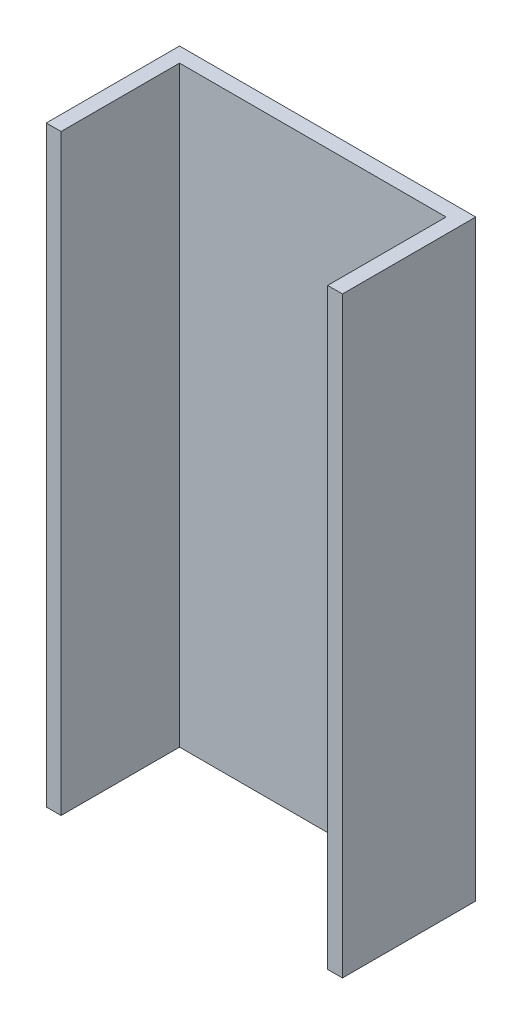
ISO-10303-21;
HEADER;
FILE_DESCRIPTION(('STEP AP214'),'2;1');
FILE_NAME('part.step','',(''),(''),'','','');
FILE_SCHEMA(('AUTOMOTIVE_DESIGN { 1 0 10303 214 1 1 1 1 }'));
ENDSEC;
DATA;
#1=APPLICATION_CONTEXT('core data for automotive mechanical design processes');
#2=APPLICATION_PROTOCOL_DEFINITION('international standard','automotive_design',2000,#1);
#3=PRODUCT_CONTEXT('',#1,'mechanical');
#4=PRODUCT('Part','Part','',(#3));
#5=PRODUCT_RELATED_PRODUCT_CATEGORY('part','',(#4));
#6=PRODUCT_DEFINITION_FORMATION('','',#4);
#7=PRODUCT_DEFINITION_CONTEXT('part definition',#1,'design');
#8=PRODUCT_DEFINITION('design','',#6,#7);
#9=PRODUCT_DEFINITION_SHAPE('','',#8);
#10=(LENGTH_UNIT() NAMED_UNIT(*) SI_UNIT(.MILLI.,.METRE.));
#11=(NAMED_UNIT(*) PLANE_ANGLE_UNIT() SI_UNIT($,.RADIAN.));
#12=(NAMED_UNIT(*) SI_UNIT($,.STERADIAN.) SOLID_ANGLE_UNIT());
#13=UNCERTAINTY_MEASURE_WITH_UNIT(LENGTH_MEASURE(1.E-05),#10,'distance_accuracy_value','');
#14=(GEOMETRIC_REPRESENTATION_CONTEXT(3) GLOBAL_UNCERTAINTY_ASSIGNED_CONTEXT((#13)) GLOBAL_UNIT_ASSIGNED_CONTEXT((#10,
#11,#12)) REPRESENTATION_CONTEXT('',''));
#15=CARTESIAN_POINT('',(0.,0.,0.));
#16=DIRECTION('',(0.,0.,1.));
#17=DIRECTION('',(1.,0.,0.));
#18=AXIS2_PLACEMENT_3D('',#15,#16,#17);
#19=CARTESIAN_POINT('',(-1000.,4000.,400.));
#20=DIRECTION('',(0.,0.,-1.));
#21=DIRECTION('',(-1.,0.,0.));
#22=AXIS2_PLACEMENT_3D('',#19,#20,#21);
#23=PLANE('',#22);
#24=DIRECTION('',(1.,0.,0.));
#25=VECTOR('',#24,1.);
#26=CARTESIAN_POINT('',(-1000.,0.,400.));
#27=LINE('',#26,#25);
#28=CARTESIAN_POINT('',(-1000.,0.,400.));
#29=VERTEX_POINT('',#28);
#30=CARTESIAN_POINT('',(-900.,0.,400.));
#31=VERTEX_POINT('',#30);
#32=EDGE_CURVE('E146',#29,#31,#27,.T.);
#33=ORIENTED_EDGE('',*,*,#32,.T.);
#34=DIRECTION('',(0.,-1.,0.));
#35=VECTOR('',#34,1.);
#36=CARTESIAN_POINT('',(-900.,4000.,400.));
#37=LINE('',#36,#35);
#38=CARTESIAN_POINT('',(-900.,4000.,400.));
#39=VERTEX_POINT('',#38);
#40=EDGE_CURVE('E11',#39,#31,#37,.T.);
#41=ORIENTED_EDGE('',*,*,#40,.F.);
#42=DIRECTION('',(1.,0.,0.));
#43=VECTOR('',#42,1.);
#44=CARTESIAN_POINT('',(-1000.,4000.,400.));
#45=LINE('',#44,#43);
#46=CARTESIAN_POINT('',(-1000.,4000.,400.));
#47=VERTEX_POINT('',#46);
#48=EDGE_CURVE('E168',#47,#39,#45,.T.);
#49=ORIENTED_EDGE('',*,*,#48,.F.);
#50=DIRECTION('',(0.,-1.,0.));
#51=VECTOR('',#50,1.);
#52=CARTESIAN_POINT('',(-1000.,4000.,400.));
#53=LINE('',#52,#51);
#54=EDGE_CURVE('E142',#47,#29,#53,.T.);
#55=ORIENTED_EDGE('',*,*,#54,.T.);
#56=EDGE_LOOP('',(#33,#41,#49,#55));
#57=FACE_BOUND('',#56,.T.);
#58=ADVANCED_FACE('F45',(#57),#23,.F.);
#59=CARTESIAN_POINT('',(-900.,4000.,-400.));
#60=DIRECTION('',(-1.,0.,0.));
#61=DIRECTION('',(0.,0.,1.));
#62=AXIS2_PLACEMENT_3D('',#59,#60,#61);
#63=PLANE('',#62);
#64=DIRECTION('',(0.,0.,-1.));
#65=VECTOR('',#64,1.);
#66=CARTESIAN_POINT('',(-900.,0.,-400.));
#67=LINE('',#66,#65);
#68=CARTESIAN_POINT('',(-900.,0.,-400.));
#69=VERTEX_POINT('',#68);
#70=EDGE_CURVE('E150',#31,#69,#67,.T.);
#71=ORIENTED_EDGE('',*,*,#70,.T.);
#72=DIRECTION('',(0.,-1.,0.));
#73=VECTOR('',#72,1.);
#74=CARTESIAN_POINT('',(-900.,4000.,-400.));
#75=LINE('',#74,#73);
#76=CARTESIAN_POINT('',(-900.,4000.,-400.));
#77=VERTEX_POINT('',#76);
#78=EDGE_CURVE('E54',#77,#69,#75,.T.);
#79=ORIENTED_EDGE('',*,*,#78,.F.);
#80=DIRECTION('',(0.,0.,-1.));
#81=VECTOR('',#80,1.);
#82=CARTESIAN_POINT('',(-900.,4000.,-400.));
#83=LINE('',#82,#81);
#84=EDGE_CURVE('E105',#39,#77,#83,.T.);
#85=ORIENTED_EDGE('',*,*,#84,.F.);
#86=ORIENTED_EDGE('',*,*,#40,.T.);
#87=EDGE_LOOP('',(#71,#79,#85,#86));
#88=FACE_BOUND('',#87,.T.);
#89=ADVANCED_FACE('F214',(#88),#63,.F.);
#90=CARTESIAN_POINT('',(900.,4000.,-400.));
#91=DIRECTION('',(0.,0.,-1.));
#92=DIRECTION('',(-1.,0.,0.));
#93=AXIS2_PLACEMENT_3D('',#90,#91,#92);
#94=PLANE('',#93);
#95=DIRECTION('',(1.,0.,0.));
#96=VECTOR('',#95,1.);
#97=CARTESIAN_POINT('',(900.,0.,-400.));
#98=LINE('',#97,#96);
#99=CARTESIAN_POINT('',(900.,0.,-400.));
#100=VERTEX_POINT('',#99);
#101=EDGE_CURVE('E153',#69,#100,#98,.T.);
#102=ORIENTED_EDGE('',*,*,#101,.T.);
#103=DIRECTION('',(0.,-1.,0.));
#104=VECTOR('',#103,1.);
#105=CARTESIAN_POINT('',(900.,4000.,-400.));
#106=LINE('',#105,#104);
#107=CARTESIAN_POINT('',(900.,4000.,-400.));
#108=VERTEX_POINT('',#107);
#109=EDGE_CURVE('E179',#108,#100,#106,.T.);
#110=ORIENTED_EDGE('',*,*,#109,.F.);
#111=DIRECTION('',(1.,0.,0.));
#112=VECTOR('',#111,1.);
#113=CARTESIAN_POINT('',(900.,4000.,-400.));
#114=LINE('',#113,#112);
#115=EDGE_CURVE('E189',#77,#108,#114,.T.);
#116=ORIENTED_EDGE('',*,*,#115,.F.);
#117=ORIENTED_EDGE('',*,*,#78,.T.);
#118=EDGE_LOOP('',(#102,#110,#116,#117));
#119=FACE_BOUND('',#118,.T.);
#120=ADVANCED_FACE('F187',(#119),#94,.F.);
#121=CARTESIAN_POINT('',(900.,4000.,400.));
#122=DIRECTION('',(1.,0.,0.));
#123=DIRECTION('',(0.,0.,-1.));
#124=AXIS2_PLACEMENT_3D('',#121,#122,#123);
#125=PLANE('',#124);
#126=DIRECTION('',(0.,0.,1.));
#127=VECTOR('',#126,1.);
#128=CARTESIAN_POINT('',(900.,0.,400.));
#129=LINE('',#128,#127);
#130=CARTESIAN_POINT('',(900.,0.,400.));
#131=VERTEX_POINT('',#130);
#132=EDGE_CURVE('E156',#100,#131,#129,.T.);
#133=ORIENTED_EDGE('',*,*,#132,.T.);
#134=DIRECTION('',(0.,-1.,0.));
#135=VECTOR('',#134,1.);
#136=CARTESIAN_POINT('',(900.,4000.,400.));
#137=LINE('',#136,#135);
#138=CARTESIAN_POINT('',(900.,4000.,400.));
#139=VERTEX_POINT('',#138);
#140=EDGE_CURVE('E175',#139,#131,#137,.T.);
#141=ORIENTED_EDGE('',*,*,#140,.F.);
#142=DIRECTION('',(0.,0.,1.));
#143=VECTOR('',#142,1.);
#144=CARTESIAN_POINT('',(900.,4000.,400.));
#145=LINE('',#144,#143);
#146=EDGE_CURVE('E202',#108,#139,#145,.T.);
#147=ORIENTED_EDGE('',*,*,#146,.F.);
#148=ORIENTED_EDGE('',*,*,#109,.T.);
#149=EDGE_LOOP('',(#133,#141,#147,#148));
#150=FACE_BOUND('',#149,.T.);
#151=ADVANCED_FACE('F197',(#150),#125,.F.);
#152=CARTESIAN_POINT('',(1000.,4000.,400.));
#153=DIRECTION('',(0.,0.,-1.));
#154=DIRECTION('',(-1.,0.,0.));
#155=AXIS2_PLACEMENT_3D('',#152,#153,#154);
#156=PLANE('',#155);
#157=DIRECTION('',(1.,0.,0.));
#158=VECTOR('',#157,1.);
#159=CARTESIAN_POINT('',(1000.,0.,400.));
#160=LINE('',#159,#158);
#161=CARTESIAN_POINT('',(1000.,0.,400.));
#162=VERTEX_POINT('',#161);
#163=EDGE_CURVE('E159',#131,#162,#160,.T.);
#164=ORIENTED_EDGE('',*,*,#163,.T.);
#165=DIRECTION('',(0.,-1.,0.));
#166=VECTOR('',#165,1.);
#167=CARTESIAN_POINT('',(1000.,4000.,400.));
#168=LINE('',#167,#166);
#169=CARTESIAN_POINT('',(1000.,4000.,400.));
#170=VERTEX_POINT('',#169);
#171=EDGE_CURVE('E135',#170,#162,#168,.T.);
#172=ORIENTED_EDGE('',*,*,#171,.F.);
#173=DIRECTION('',(1.,0.,0.));
#174=VECTOR('',#173,1.);
#175=CARTESIAN_POINT('',(1000.,4000.,400.));
#176=LINE('',#175,#174);
#177=EDGE_CURVE('E124',#139,#170,#176,.T.);
#178=ORIENTED_EDGE('',*,*,#177,.F.);
#179=ORIENTED_EDGE('',*,*,#140,.T.);
#180=EDGE_LOOP('',(#164,#172,#178,#179));
#181=FACE_BOUND('',#180,.T.);
#182=ADVANCED_FACE('F200',(#181),#156,.F.);
#183=CARTESIAN_POINT('',(1000.,4000.,-500.));
#184=DIRECTION('',(-1.,0.,0.));
#185=DIRECTION('',(0.,0.,1.));
#186=AXIS2_PLACEMENT_3D('',#183,#184,#185);
#187=PLANE('',#186);
#188=DIRECTION('',(0.,0.,-1.));
#189=VECTOR('',#188,1.);
#190=CARTESIAN_POINT('',(1000.,0.,-500.));
#191=LINE('',#190,#189);
#192=CARTESIAN_POINT('',(1000.,0.,-500.));
#193=VERTEX_POINT('',#192);
#194=EDGE_CURVE('E133',#162,#193,#191,.T.);
#195=ORIENTED_EDGE('',*,*,#194,.T.);
#196=DIRECTION('',(0.,-1.,0.));
#197=VECTOR('',#196,1.);
#198=CARTESIAN_POINT('',(1000.,4000.,-500.));
#199=LINE('',#198,#197);
#200=CARTESIAN_POINT('',(1000.,4000.,-500.));
#201=VERTEX_POINT('',#200);
#202=EDGE_CURVE('E130',#201,#193,#199,.T.);
#203=ORIENTED_EDGE('',*,*,#202,.F.);
#204=DIRECTION('',(0.,0.,-1.));
#205=VECTOR('',#204,1.);
#206=CARTESIAN_POINT('',(1000.,4000.,-500.));
#207=LINE('',#206,#205);
#208=EDGE_CURVE('E118',#170,#201,#207,.T.);
#209=ORIENTED_EDGE('',*,*,#208,.F.);
#210=ORIENTED_EDGE('',*,*,#171,.T.);
#211=EDGE_LOOP('',(#195,#203,#209,#210));
#212=FACE_BOUND('',#211,.T.);
#213=ADVANCED_FACE('F131',(#212),#187,.F.);
#214=CARTESIAN_POINT('',(-1000.,4000.,-500.));
#215=DIRECTION('',(0.,0.,1.));
#216=DIRECTION('',(1.,0.,0.));
#217=AXIS2_PLACEMENT_3D('',#214,#215,#216);
#218=PLANE('',#217);
#219=DIRECTION('',(-1.,0.,0.));
#220=VECTOR('',#219,1.);
#221=CARTESIAN_POINT('',(-1000.,0.,-500.));
#222=LINE('',#221,#220);
#223=CARTESIAN_POINT('',(-1000.,0.,-500.));
#224=VERTEX_POINT('',#223);
#225=EDGE_CURVE('E91',#193,#224,#222,.T.);
#226=ORIENTED_EDGE('',*,*,#225,.T.);
#227=DIRECTION('',(0.,-1.,0.));
#228=VECTOR('',#227,1.);
#229=CARTESIAN_POINT('',(-1000.,4000.,-500.));
#230=LINE('',#229,#228);
#231=CARTESIAN_POINT('',(-1000.,4000.,-500.));
#232=VERTEX_POINT('',#231);
#233=EDGE_CURVE('E136',#232,#224,#230,.T.);
#234=ORIENTED_EDGE('',*,*,#233,.F.);
#235=DIRECTION('',(-1.,0.,0.));
#236=VECTOR('',#235,1.);
#237=CARTESIAN_POINT('',(-1000.,4000.,-500.));
#238=LINE('',#237,#236);
#239=EDGE_CURVE('E122',#201,#232,#238,.T.);
#240=ORIENTED_EDGE('',*,*,#239,.F.);
#241=ORIENTED_EDGE('',*,*,#202,.T.);
#242=EDGE_LOOP('',(#226,#234,#240,#241));
#243=FACE_BOUND('',#242,.T.);
#244=ADVANCED_FACE('F138',(#243),#218,.F.);
#245=CARTESIAN_POINT('',(-1000.,4000.,400.));
#246=DIRECTION('',(1.,0.,0.));
#247=DIRECTION('',(0.,0.,-1.));
#248=AXIS2_PLACEMENT_3D('',#245,#246,#247);
#249=PLANE('',#248);
#250=DIRECTION('',(0.,0.,1.));
#251=VECTOR('',#250,1.);
#252=CARTESIAN_POINT('',(-1000.,0.,400.));
#253=LINE('',#252,#251);
#254=EDGE_CURVE('E97',#224,#29,#253,.T.);
#255=ORIENTED_EDGE('',*,*,#254,.T.);
#256=ORIENTED_EDGE('',*,*,#54,.F.);
#257=DIRECTION('',(0.,0.,1.));
#258=VECTOR('',#257,1.);
#259=CARTESIAN_POINT('',(-1000.,4000.,400.));
#260=LINE('',#259,#258);
#261=EDGE_CURVE('E62',#232,#47,#260,.T.);
#262=ORIENTED_EDGE('',*,*,#261,.F.);
#263=ORIENTED_EDGE('',*,*,#233,.T.);
#264=EDGE_LOOP('',(#255,#256,#262,#263));
#265=FACE_BOUND('',#264,.T.);
#266=ADVANCED_FACE('F230',(#265),#249,.F.);
#267=CARTESIAN_POINT('',(0.,4000.,0.));
#268=DIRECTION('',(0.,-1.,0.));
#269=DIRECTION('',(0.,0.,-1.));
#270=AXIS2_PLACEMENT_3D('',#267,#268,#269);
#271=PLANE('',#270);
#272=ORIENTED_EDGE('',*,*,#48,.T.);
#273=ORIENTED_EDGE('',*,*,#84,.T.);
#274=ORIENTED_EDGE('',*,*,#115,.T.);
#275=ORIENTED_EDGE('',*,*,#146,.T.);
#276=ORIENTED_EDGE('',*,*,#177,.T.);
#277=ORIENTED_EDGE('',*,*,#208,.T.);
#278=ORIENTED_EDGE('',*,*,#239,.T.);
#279=ORIENTED_EDGE('',*,*,#261,.T.);
#280=EDGE_LOOP('',(#272,#273,#274,#275,#276,#277,#278,#279));
#281=FACE_BOUND('',#280,.T.);
#282=ADVANCED_FACE('F120',(#281),#271,.F.);
#283=CARTESIAN_POINT('',(0.,0.,0.));
#284=DIRECTION('',(0.,-1.,0.));
#285=DIRECTION('',(0.,0.,-1.));
#286=AXIS2_PLACEMENT_3D('',#283,#284,#285);
#287=PLANE('',#286);
#288=ORIENTED_EDGE('',*,*,#32,.F.);
#289=ORIENTED_EDGE('',*,*,#254,.F.);
#290=ORIENTED_EDGE('',*,*,#225,.F.);
#291=ORIENTED_EDGE('',*,*,#194,.F.);
#292=ORIENTED_EDGE('',*,*,#163,.F.);
#293=ORIENTED_EDGE('',*,*,#132,.F.);
#294=ORIENTED_EDGE('',*,*,#101,.F.);
#295=ORIENTED_EDGE('',*,*,#70,.F.);
#296=EDGE_LOOP('',(#288,#289,#290,#291,#292,#293,#294,#295));
#297=FACE_BOUND('',#296,.T.);
#298=ADVANCED_FACE('F193',(#297),#287,.T.);
#299=CLOSED_SHELL('',(#58,#89,#120,#151,#182,#213,#244,#266,#282,#298));
#300=MANIFOLD_SOLID_BREP('B2',#299);
#301=ADVANCED_BREP_SHAPE_REPRESENTATION('',(#18,#300),#14);
#302=SHAPE_DEFINITION_REPRESENTATION(#9,#301);
ENDSEC;
END-ISO-10303-21;
